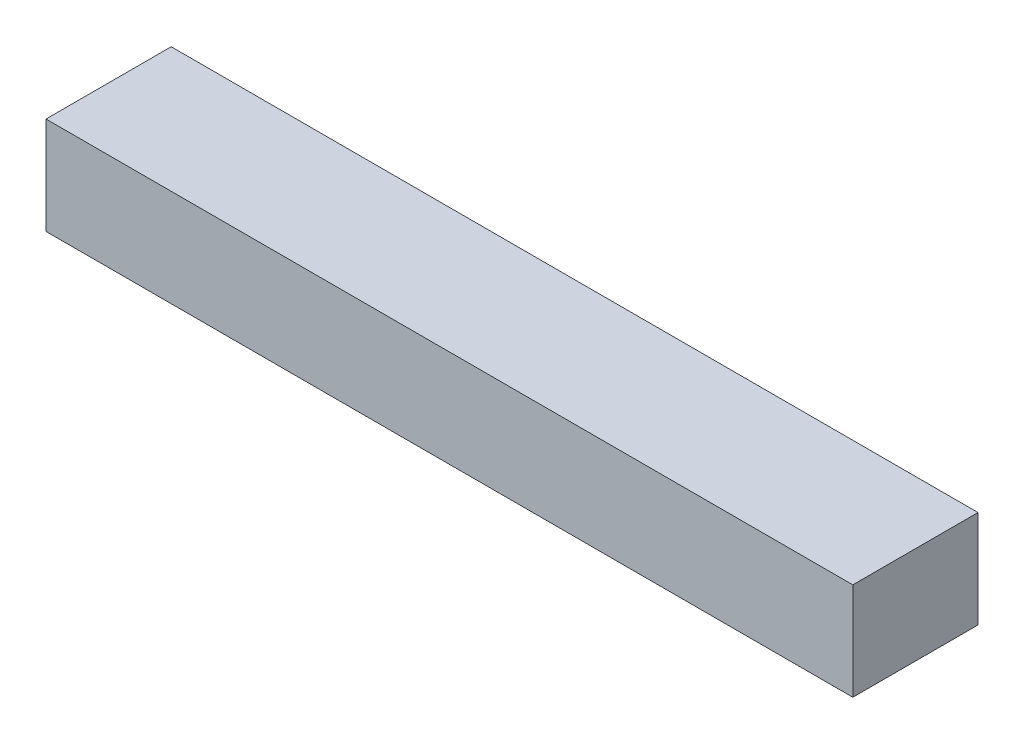
ISO-10303-21;
HEADER;
FILE_DESCRIPTION(('STEP AP214'),'2;1');
FILE_NAME('part.step','',(''),(''),'','','');
FILE_SCHEMA(('AUTOMOTIVE_DESIGN { 1 0 10303 214 1 1 1 1 }'));
ENDSEC;
DATA;
#1=APPLICATION_CONTEXT('core data for automotive mechanical design processes');
#2=APPLICATION_PROTOCOL_DEFINITION('international standard','automotive_design',2000,#1);
#3=PRODUCT_CONTEXT('',#1,'mechanical');
#4=PRODUCT('Part','Part','',(#3));
#5=PRODUCT_RELATED_PRODUCT_CATEGORY('part','',(#4));
#6=PRODUCT_DEFINITION_FORMATION('','',#4);
#7=PRODUCT_DEFINITION_CONTEXT('part definition',#1,'design');
#8=PRODUCT_DEFINITION('design','',#6,#7);
#9=PRODUCT_DEFINITION_SHAPE('','',#8);
#10=(LENGTH_UNIT() NAMED_UNIT(*) SI_UNIT(.MILLI.,.METRE.));
#11=(NAMED_UNIT(*) PLANE_ANGLE_UNIT() SI_UNIT($,.RADIAN.));
#12=(NAMED_UNIT(*) SI_UNIT($,.STERADIAN.) SOLID_ANGLE_UNIT());
#13=UNCERTAINTY_MEASURE_WITH_UNIT(LENGTH_MEASURE(1.E-05),#10,'distance_accuracy_value','');
#14=(GEOMETRIC_REPRESENTATION_CONTEXT(3) GLOBAL_UNCERTAINTY_ASSIGNED_CONTEXT((#13)) GLOBAL_UNIT_ASSIGNED_CONTEXT((#10,
#11,#12)) REPRESENTATION_CONTEXT('',''));
#15=CARTESIAN_POINT('',(0.,0.,0.));
#16=DIRECTION('',(0.,0.,1.));
#17=DIRECTION('',(1.,0.,0.));
#18=AXIS2_PLACEMENT_3D('',#15,#16,#17);
#19=CARTESIAN_POINT('',(-58.,-7.,-18.));
#20=DIRECTION('',(-1.,0.,0.));
#21=DIRECTION('',(0.,0.,1.));
#22=AXIS2_PLACEMENT_3D('',#19,#20,#21);
#23=PLANE('',#22);
#24=DIRECTION('',(0.,-1.,0.));
#25=VECTOR('',#24,1.);
#26=CARTESIAN_POINT('',(-58.,-7.,0.));
#27=LINE('',#26,#25);
#28=CARTESIAN_POINT('',(-58.,7.,0.));
#29=VERTEX_POINT('',#28);
#30=CARTESIAN_POINT('',(-58.,-7.,0.));
#31=VERTEX_POINT('',#30);
#32=EDGE_CURVE('E103',#29,#31,#27,.T.);
#33=ORIENTED_EDGE('',*,*,#32,.F.);
#34=DIRECTION('',(0.,0.,1.));
#35=VECTOR('',#34,1.);
#36=CARTESIAN_POINT('',(-58.,7.,-18.));
#37=LINE('',#36,#35);
#38=CARTESIAN_POINT('',(-58.,7.,-18.));
#39=VERTEX_POINT('',#38);
#40=EDGE_CURVE('E11',#39,#29,#37,.T.);
#41=ORIENTED_EDGE('',*,*,#40,.F.);
#42=DIRECTION('',(0.,-1.,0.));
#43=VECTOR('',#42,1.);
#44=CARTESIAN_POINT('',(-58.,-7.,-18.));
#45=LINE('',#44,#43);
#46=CARTESIAN_POINT('',(-58.,-7.,-18.));
#47=VERTEX_POINT('',#46);
#48=EDGE_CURVE('E97',#39,#47,#45,.T.);
#49=ORIENTED_EDGE('',*,*,#48,.T.);
#50=DIRECTION('',(0.,0.,1.));
#51=VECTOR('',#50,1.);
#52=CARTESIAN_POINT('',(-58.,-7.,-18.));
#53=LINE('',#52,#51);
#54=EDGE_CURVE('E42',#47,#31,#53,.T.);
#55=ORIENTED_EDGE('',*,*,#54,.T.);
#56=EDGE_LOOP('',(#33,#41,#49,#55));
#57=FACE_BOUND('',#56,.T.);
#58=ADVANCED_FACE('F39',(#57),#23,.T.);
#59=CARTESIAN_POINT('',(-58.,7.,-18.));
#60=DIRECTION('',(0.,1.,0.));
#61=DIRECTION('',(0.,0.,1.));
#62=AXIS2_PLACEMENT_3D('',#59,#60,#61);
#63=PLANE('',#62);
#64=DIRECTION('',(-1.,0.,0.));
#65=VECTOR('',#64,1.);
#66=CARTESIAN_POINT('',(-58.,7.,0.));
#67=LINE('',#66,#65);
#68=CARTESIAN_POINT('',(58.,7.,0.));
#69=VERTEX_POINT('',#68);
#70=EDGE_CURVE('E99',#69,#29,#67,.T.);
#71=ORIENTED_EDGE('',*,*,#70,.F.);
#72=DIRECTION('',(0.,0.,1.));
#73=VECTOR('',#72,1.);
#74=CARTESIAN_POINT('',(58.,7.,-18.));
#75=LINE('',#74,#73);
#76=CARTESIAN_POINT('',(58.,7.,-18.));
#77=VERTEX_POINT('',#76);
#78=EDGE_CURVE('E48',#77,#69,#75,.T.);
#79=ORIENTED_EDGE('',*,*,#78,.F.);
#80=DIRECTION('',(-1.,0.,0.));
#81=VECTOR('',#80,1.);
#82=CARTESIAN_POINT('',(-58.,7.,-18.));
#83=LINE('',#82,#81);
#84=EDGE_CURVE('E94',#77,#39,#83,.T.);
#85=ORIENTED_EDGE('',*,*,#84,.T.);
#86=ORIENTED_EDGE('',*,*,#40,.T.);
#87=EDGE_LOOP('',(#71,#79,#85,#86));
#88=FACE_BOUND('',#87,.T.);
#89=ADVANCED_FACE('F113',(#88),#63,.T.);
#90=CARTESIAN_POINT('',(58.,-7.,-18.));
#91=DIRECTION('',(1.,0.,0.));
#92=DIRECTION('',(0.,0.,-1.));
#93=AXIS2_PLACEMENT_3D('',#90,#91,#92);
#94=PLANE('',#93);
#95=DIRECTION('',(0.,1.,0.));
#96=VECTOR('',#95,1.);
#97=CARTESIAN_POINT('',(58.,-7.,0.));
#98=LINE('',#97,#96);
#99=CARTESIAN_POINT('',(58.,-7.,0.));
#100=VERTEX_POINT('',#99);
#101=EDGE_CURVE('E89',#100,#69,#98,.T.);
#102=ORIENTED_EDGE('',*,*,#101,.F.);
#103=DIRECTION('',(0.,0.,1.));
#104=VECTOR('',#103,1.);
#105=CARTESIAN_POINT('',(58.,-7.,-18.));
#106=LINE('',#105,#104);
#107=CARTESIAN_POINT('',(58.,-7.,-18.));
#108=VERTEX_POINT('',#107);
#109=EDGE_CURVE('E84',#108,#100,#106,.T.);
#110=ORIENTED_EDGE('',*,*,#109,.F.);
#111=DIRECTION('',(0.,1.,0.));
#112=VECTOR('',#111,1.);
#113=CARTESIAN_POINT('',(58.,-7.,-18.));
#114=LINE('',#113,#112);
#115=EDGE_CURVE('E87',#108,#77,#114,.T.);
#116=ORIENTED_EDGE('',*,*,#115,.T.);
#117=ORIENTED_EDGE('',*,*,#78,.T.);
#118=EDGE_LOOP('',(#102,#110,#116,#117));
#119=FACE_BOUND('',#118,.T.);
#120=ADVANCED_FACE('F86',(#119),#94,.T.);
#121=CARTESIAN_POINT('',(-58.,-7.,-18.));
#122=DIRECTION('',(0.,-1.,0.));
#123=DIRECTION('',(0.,0.,-1.));
#124=AXIS2_PLACEMENT_3D('',#121,#122,#123);
#125=PLANE('',#124);
#126=DIRECTION('',(1.,0.,0.));
#127=VECTOR('',#126,1.);
#128=CARTESIAN_POINT('',(-58.,-7.,0.));
#129=LINE('',#128,#127);
#130=EDGE_CURVE('E106',#31,#100,#129,.T.);
#131=ORIENTED_EDGE('',*,*,#130,.F.);
#132=ORIENTED_EDGE('',*,*,#54,.F.);
#133=DIRECTION('',(1.,0.,0.));
#134=VECTOR('',#133,1.);
#135=CARTESIAN_POINT('',(-58.,-7.,-18.));
#136=LINE('',#135,#134);
#137=EDGE_CURVE('E93',#47,#108,#136,.T.);
#138=ORIENTED_EDGE('',*,*,#137,.T.);
#139=ORIENTED_EDGE('',*,*,#109,.T.);
#140=EDGE_LOOP('',(#131,#132,#138,#139));
#141=FACE_BOUND('',#140,.T.);
#142=ADVANCED_FACE('F96',(#141),#125,.T.);
#143=CARTESIAN_POINT('',(0.,0.,-18.));
#144=DIRECTION('',(0.,0.,-1.));
#145=DIRECTION('',(-1.,0.,0.));
#146=AXIS2_PLACEMENT_3D('',#143,#144,#145);
#147=PLANE('',#146);
#148=ORIENTED_EDGE('',*,*,#48,.F.);
#149=ORIENTED_EDGE('',*,*,#84,.F.);
#150=ORIENTED_EDGE('',*,*,#115,.F.);
#151=ORIENTED_EDGE('',*,*,#137,.F.);
#152=EDGE_LOOP('',(#148,#149,#150,#151));
#153=FACE_BOUND('',#152,.T.);
#154=ADVANCED_FACE('F92',(#153),#147,.T.);
#155=CARTESIAN_POINT('',(0.,0.,0.));
#156=DIRECTION('',(0.,0.,-1.));
#157=DIRECTION('',(-1.,0.,0.));
#158=AXIS2_PLACEMENT_3D('',#155,#156,#157);
#159=PLANE('',#158);
#160=ORIENTED_EDGE('',*,*,#32,.T.);
#161=ORIENTED_EDGE('',*,*,#130,.T.);
#162=ORIENTED_EDGE('',*,*,#101,.T.);
#163=ORIENTED_EDGE('',*,*,#70,.T.);
#164=EDGE_LOOP('',(#160,#161,#162,#163));
#165=FACE_BOUND('',#164,.T.);
#166=ADVANCED_FACE('F112',(#165),#159,.F.);
#167=CLOSED_SHELL('',(#58,#89,#120,#142,#154,#166));
#168=MANIFOLD_SOLID_BREP('B2',#167);
#169=ADVANCED_BREP_SHAPE_REPRESENTATION('',(#18,#168),#14);
#170=SHAPE_DEFINITION_REPRESENTATION(#9,#169);
ENDSEC;
END-ISO-10303-21;
